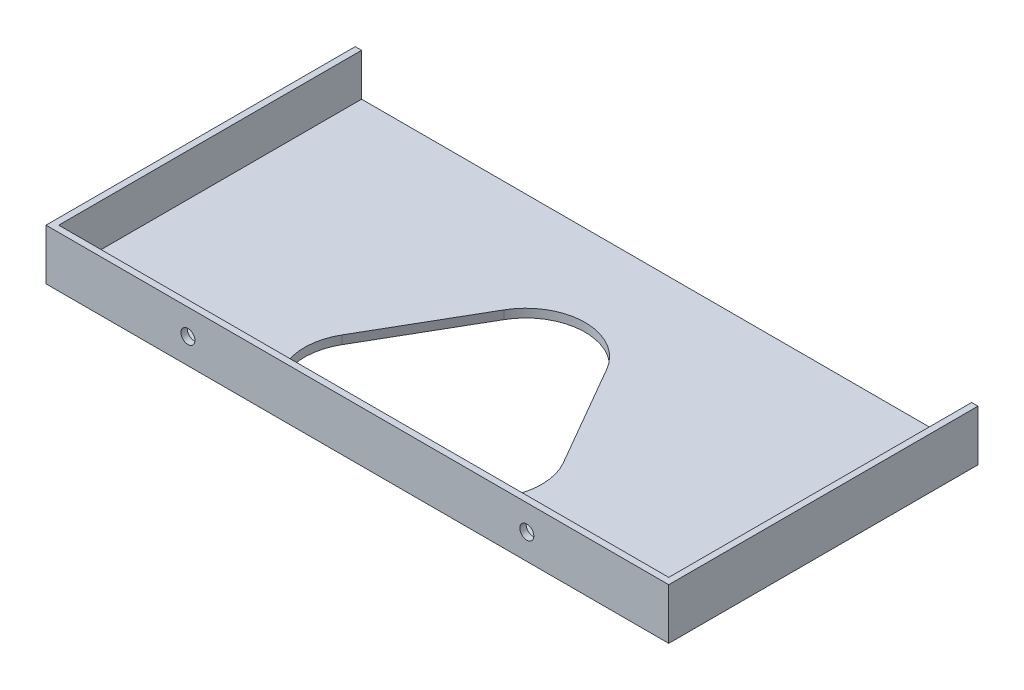
ISO-10303-21;
HEADER;
FILE_DESCRIPTION(('STEP AP214'),'2;1');
FILE_NAME('part.step','',(''),(''),'','','');
FILE_SCHEMA(('AUTOMOTIVE_DESIGN { 1 0 10303 214 1 1 1 1 }'));
ENDSEC;
DATA;
#1=APPLICATION_CONTEXT('core data for automotive mechanical design processes');
#2=APPLICATION_PROTOCOL_DEFINITION('international standard','automotive_design',2000,#1);
#3=PRODUCT_CONTEXT('',#1,'mechanical');
#4=PRODUCT('Part','Part','',(#3));
#5=PRODUCT_RELATED_PRODUCT_CATEGORY('part','',(#4));
#6=PRODUCT_DEFINITION_FORMATION('','',#4);
#7=PRODUCT_DEFINITION_CONTEXT('part definition',#1,'design');
#8=PRODUCT_DEFINITION('design','',#6,#7);
#9=PRODUCT_DEFINITION_SHAPE('','',#8);
#10=(LENGTH_UNIT() NAMED_UNIT(*) SI_UNIT(.MILLI.,.METRE.));
#11=(NAMED_UNIT(*) PLANE_ANGLE_UNIT() SI_UNIT($,.RADIAN.));
#12=(NAMED_UNIT(*) SI_UNIT($,.STERADIAN.) SOLID_ANGLE_UNIT());
#13=UNCERTAINTY_MEASURE_WITH_UNIT(LENGTH_MEASURE(1.E-05),#10,'distance_accuracy_value','');
#14=(GEOMETRIC_REPRESENTATION_CONTEXT(3) GLOBAL_UNCERTAINTY_ASSIGNED_CONTEXT((#13)) GLOBAL_UNIT_ASSIGNED_CONTEXT((#10,
#11,#12)) REPRESENTATION_CONTEXT('',''));
#15=CARTESIAN_POINT('',(0.,0.,0.));
#16=DIRECTION('',(0.,0.,1.));
#17=DIRECTION('',(1.,0.,0.));
#18=AXIS2_PLACEMENT_3D('',#15,#16,#17);
#19=CARTESIAN_POINT('',(0.,12.,0.));
#20=DIRECTION('',(1.,0.,0.));
#21=DIRECTION('',(0.,0.,-1.));
#22=AXIS2_PLACEMENT_3D('',#19,#20,#21);
#23=PLANE('',#22);
#24=DIRECTION('',(0.,0.,1.));
#25=VECTOR('',#24,1.);
#26=CARTESIAN_POINT('',(0.,12.,0.));
#27=LINE('',#26,#25);
#28=CARTESIAN_POINT('',(0.,12.,-73.));
#29=VERTEX_POINT('',#28);
#30=CARTESIAN_POINT('',(0.,12.,0.));
#31=VERTEX_POINT('',#30);
#32=EDGE_CURVE('E153',#29,#31,#27,.T.);
#33=ORIENTED_EDGE('',*,*,#32,.F.);
#34=DIRECTION('',(0.,1.,0.));
#35=VECTOR('',#34,1.);
#36=CARTESIAN_POINT('',(0.,0.,-73.));
#37=LINE('',#36,#35);
#38=CARTESIAN_POINT('',(0.,0.,-73.));
#39=VERTEX_POINT('',#38);
#40=EDGE_CURVE('E138',#39,#29,#37,.T.);
#41=ORIENTED_EDGE('',*,*,#40,.F.);
#42=DIRECTION('',(0.,0.,1.));
#43=VECTOR('',#42,1.);
#44=CARTESIAN_POINT('',(0.,0.,0.));
#45=LINE('',#44,#43);
#46=CARTESIAN_POINT('',(0.,0.,0.));
#47=VERTEX_POINT('',#46);
#48=EDGE_CURVE('E151',#39,#47,#45,.T.);
#49=ORIENTED_EDGE('',*,*,#48,.T.);
#50=DIRECTION('',(0.,-1.,0.));
#51=VECTOR('',#50,1.);
#52=CARTESIAN_POINT('',(0.,12.,0.));
#53=LINE('',#52,#51);
#54=EDGE_CURVE('E174',#31,#47,#53,.T.);
#55=ORIENTED_EDGE('',*,*,#54,.F.);
#56=EDGE_LOOP('',(#33,#41,#49,#55));
#57=FACE_BOUND('',#56,.T.);
#58=ADVANCED_FACE('F37',(#57),#23,.F.);
#59=CARTESIAN_POINT('',(0.,12.,0.));
#60=DIRECTION('',(0.,0.,-1.));
#61=DIRECTION('',(-1.,0.,0.));
#62=AXIS2_PLACEMENT_3D('',#59,#60,#61);
#63=PLANE('',#62);
#64=CARTESIAN_POINT('',(113.5,6.,0.));
#65=DIRECTION('',(0.,0.,-1.));
#66=DIRECTION('',(-1.,0.,0.));
#67=AXIS2_PLACEMENT_3D('',#64,#65,#66);
#68=CIRCLE('',#67,1.65);
#69=CARTESIAN_POINT('',(111.85,6.,0.));
#70=VERTEX_POINT('',#69);
#71=EDGE_CURVE('E217',#70,#70,#68,.T.);
#72=ORIENTED_EDGE('',*,*,#71,.T.);
#73=EDGE_LOOP('',(#72));
#74=FACE_BOUND('',#73,.T.);
#75=CARTESIAN_POINT('',(33.5,6.,0.));
#76=DIRECTION('',(0.,0.,-1.));
#77=DIRECTION('',(1.,0.,0.));
#78=AXIS2_PLACEMENT_3D('',#75,#76,#77);
#79=CIRCLE('',#78,1.65);
#80=CARTESIAN_POINT('',(35.15,6.,0.));
#81=VERTEX_POINT('',#80);
#82=EDGE_CURVE('E216',#81,#81,#79,.T.);
#83=ORIENTED_EDGE('',*,*,#82,.T.);
#84=EDGE_LOOP('',(#83));
#85=FACE_BOUND('',#84,.T.);
#86=DIRECTION('',(1.,0.,0.));
#87=VECTOR('',#86,1.);
#88=CARTESIAN_POINT('',(0.,0.,0.));
#89=LINE('',#88,#87);
#90=CARTESIAN_POINT('',(147.,0.,0.));
#91=VERTEX_POINT('',#90);
#92=EDGE_CURVE('E157',#47,#91,#89,.T.);
#93=ORIENTED_EDGE('',*,*,#92,.T.);
#94=DIRECTION('',(0.,-1.,0.));
#95=VECTOR('',#94,1.);
#96=CARTESIAN_POINT('',(147.,12.,0.));
#97=LINE('',#96,#95);
#98=CARTESIAN_POINT('',(147.,12.,0.));
#99=VERTEX_POINT('',#98);
#100=EDGE_CURVE('E171',#99,#91,#97,.T.);
#101=ORIENTED_EDGE('',*,*,#100,.F.);
#102=DIRECTION('',(1.,0.,0.));
#103=VECTOR('',#102,1.);
#104=CARTESIAN_POINT('',(0.,12.,0.));
#105=LINE('',#104,#103);
#106=EDGE_CURVE('E246',#31,#99,#105,.T.);
#107=ORIENTED_EDGE('',*,*,#106,.F.);
#108=ORIENTED_EDGE('',*,*,#54,.T.);
#109=EDGE_LOOP('',(#93,#101,#107,#108));
#110=FACE_BOUND('',#109,.T.);
#111=ADVANCED_FACE('F312',(#74,#85,#110),#63,.F.);
#112=CARTESIAN_POINT('',(147.,12.,0.));
#113=DIRECTION('',(-1.,0.,0.));
#114=DIRECTION('',(0.,0.,1.));
#115=AXIS2_PLACEMENT_3D('',#112,#113,#114);
#116=PLANE('',#115);
#117=DIRECTION('',(0.,0.,-1.));
#118=VECTOR('',#117,1.);
#119=CARTESIAN_POINT('',(147.,0.,0.));
#120=LINE('',#119,#118);
#121=CARTESIAN_POINT('',(147.,0.,-73.));
#122=VERTEX_POINT('',#121);
#123=EDGE_CURVE('E161',#91,#122,#120,.T.);
#124=ORIENTED_EDGE('',*,*,#123,.T.);
#125=DIRECTION('',(0.,1.,0.));
#126=VECTOR('',#125,1.);
#127=CARTESIAN_POINT('',(147.,0.,-73.));
#128=LINE('',#127,#126);
#129=CARTESIAN_POINT('',(147.,12.,-73.));
#130=VERTEX_POINT('',#129);
#131=EDGE_CURVE('E141',#122,#130,#128,.T.);
#132=ORIENTED_EDGE('',*,*,#131,.T.);
#133=DIRECTION('',(0.,0.,-1.));
#134=VECTOR('',#133,1.);
#135=CARTESIAN_POINT('',(147.,12.,0.));
#136=LINE('',#135,#134);
#137=EDGE_CURVE('E167',#99,#130,#136,.T.);
#138=ORIENTED_EDGE('',*,*,#137,.F.);
#139=ORIENTED_EDGE('',*,*,#100,.T.);
#140=EDGE_LOOP('',(#124,#132,#138,#139));
#141=FACE_BOUND('',#140,.T.);
#142=ADVANCED_FACE('F257',(#141),#116,.F.);
#143=CARTESIAN_POINT('',(0.,12.,0.));
#144=DIRECTION('',(0.,-1.,0.));
#145=DIRECTION('',(0.,0.,-1.));
#146=AXIS2_PLACEMENT_3D('',#143,#144,#145);
#147=PLANE('',#146);
#148=ORIENTED_EDGE('',*,*,#137,.T.);
#149=DIRECTION('',(1.,0.,0.));
#150=VECTOR('',#149,1.);
#151=CARTESIAN_POINT('',(0.,12.,-73.));
#152=LINE('',#151,#150);
#153=CARTESIAN_POINT('',(145.5,12.,-73.));
#154=VERTEX_POINT('',#153);
#155=EDGE_CURVE('E255',#154,#130,#152,.T.);
#156=ORIENTED_EDGE('',*,*,#155,.F.);
#157=DIRECTION('',(0.,0.,-1.));
#158=VECTOR('',#157,1.);
#159=CARTESIAN_POINT('',(145.5,12.,-1.5));
#160=LINE('',#159,#158);
#161=CARTESIAN_POINT('',(145.5,12.,-1.5));
#162=VERTEX_POINT('',#161);
#163=EDGE_CURVE('E229',#162,#154,#160,.T.);
#164=ORIENTED_EDGE('',*,*,#163,.F.);
#165=DIRECTION('',(1.,0.,0.));
#166=VECTOR('',#165,1.);
#167=CARTESIAN_POINT('',(1.5,12.,-1.5));
#168=LINE('',#167,#166);
#169=CARTESIAN_POINT('',(1.5,12.,-1.5));
#170=VERTEX_POINT('',#169);
#171=EDGE_CURVE('E233',#170,#162,#168,.T.);
#172=ORIENTED_EDGE('',*,*,#171,.F.);
#173=DIRECTION('',(0.,0.,1.));
#174=VECTOR('',#173,1.);
#175=CARTESIAN_POINT('',(1.5,12.,-74.5));
#176=LINE('',#175,#174);
#177=CARTESIAN_POINT('',(1.5,12.,-73.));
#178=VERTEX_POINT('',#177);
#179=EDGE_CURVE('E228',#178,#170,#176,.T.);
#180=ORIENTED_EDGE('',*,*,#179,.F.);
#181=EDGE_CURVE('E146',#29,#178,#152,.T.);
#182=ORIENTED_EDGE('',*,*,#181,.F.);
#183=ORIENTED_EDGE('',*,*,#32,.T.);
#184=ORIENTED_EDGE('',*,*,#106,.T.);
#185=EDGE_LOOP('',(#148,#156,#164,#172,#180,#182,#183,#184));
#186=FACE_BOUND('',#185,.T.);
#187=ADVANCED_FACE('F253',(#186),#147,.F.);
#188=CARTESIAN_POINT('',(0.,0.,0.));
#189=DIRECTION('',(0.,-1.,0.));
#190=DIRECTION('',(0.,0.,-1.));
#191=AXIS2_PLACEMENT_3D('',#188,#189,#190);
#192=PLANE('',#191);
#193=DIRECTION('',(1.,0.,0.));
#194=VECTOR('',#193,1.);
#195=CARTESIAN_POINT('',(0.,0.,-73.));
#196=LINE('',#195,#194);
#197=EDGE_CURVE('E135',#39,#122,#196,.T.);
#198=ORIENTED_EDGE('',*,*,#197,.T.);
#199=ORIENTED_EDGE('',*,*,#123,.F.);
#200=ORIENTED_EDGE('',*,*,#92,.F.);
#201=ORIENTED_EDGE('',*,*,#48,.F.);
#202=EDGE_LOOP('',(#198,#199,#200,#201));
#203=FACE_BOUND('',#202,.T.);
#204=CARTESIAN_POINT('',(59.5,0.,-15.5));
#205=DIRECTION('',(0.,-1.,0.));
#206=DIRECTION('',(0.,0.,-1.));
#207=AXIS2_PLACEMENT_3D('',#204,#205,#206);
#208=CIRCLE('',#207,14.);
#209=CARTESIAN_POINT('',(59.5,0.,-1.5));
#210=VERTEX_POINT('',#209);
#211=CARTESIAN_POINT('',(47.3756443470179,0.,-22.5));
#212=VERTEX_POINT('',#211);
#213=EDGE_CURVE('E58',#210,#212,#208,.T.);
#214=ORIENTED_EDGE('',*,*,#213,.F.);
#215=DIRECTION('',(-1.,0.,0.));
#216=VECTOR('',#215,1.);
#217=CARTESIAN_POINT('',(59.5,0.,-1.5));
#218=LINE('',#217,#216);
#219=CARTESIAN_POINT('',(87.5,0.,-1.49999999999999));
#220=VERTEX_POINT('',#219);
#221=EDGE_CURVE('E210',#220,#210,#218,.T.);
#222=ORIENTED_EDGE('',*,*,#221,.F.);
#223=CARTESIAN_POINT('',(87.5,0.,-15.5));
#224=DIRECTION('',(0.,-1.,0.));
#225=DIRECTION('',(0.,0.,-1.));
#226=AXIS2_PLACEMENT_3D('',#223,#224,#225);
#227=CIRCLE('',#226,14.);
#228=CARTESIAN_POINT('',(99.6243556529821,0.,-22.5));
#229=VERTEX_POINT('',#228);
#230=EDGE_CURVE('E272',#229,#220,#227,.T.);
#231=ORIENTED_EDGE('',*,*,#230,.F.);
#232=DIRECTION('',(0.5,0.,0.866025403784438));
#233=VECTOR('',#232,1.);
#234=CARTESIAN_POINT('',(99.6243556529821,0.,-22.5));
#235=LINE('',#234,#233);
#236=CARTESIAN_POINT('',(85.6243556529821,0.,-46.7487113059643));
#237=VERTEX_POINT('',#236);
#238=EDGE_CURVE('E270',#237,#229,#235,.T.);
#239=ORIENTED_EDGE('',*,*,#238,.F.);
#240=CARTESIAN_POINT('',(73.5,0.,-39.7487113059643));
#241=DIRECTION('',(0.,-1.,0.));
#242=DIRECTION('',(0.,0.,-1.));
#243=AXIS2_PLACEMENT_3D('',#240,#241,#242);
#244=CIRCLE('',#243,14.);
#245=CARTESIAN_POINT('',(61.3756443470179,0.,-46.7487113059643));
#246=VERTEX_POINT('',#245);
#247=EDGE_CURVE('E199',#246,#237,#244,.T.);
#248=ORIENTED_EDGE('',*,*,#247,.F.);
#249=DIRECTION('',(0.500000000000001,0.,-0.866025403784438));
#250=VECTOR('',#249,1.);
#251=CARTESIAN_POINT('',(61.3756443470179,0.,-46.7487113059643));
#252=LINE('',#251,#250);
#253=EDGE_CURVE('E266',#212,#246,#252,.T.);
#254=ORIENTED_EDGE('',*,*,#253,.F.);
#255=EDGE_LOOP('',(#214,#222,#231,#239,#248,#254));
#256=FACE_BOUND('',#255,.T.);
#257=ADVANCED_FACE('F155',(#203,#256),#192,.T.);
#258=CARTESIAN_POINT('',(0.,2.,0.));
#259=DIRECTION('',(0.,-1.,0.));
#260=DIRECTION('',(0.,0.,-1.));
#261=AXIS2_PLACEMENT_3D('',#258,#259,#260);
#262=PLANE('',#261);
#263=DIRECTION('',(0.,0.,-1.));
#264=VECTOR('',#263,1.);
#265=CARTESIAN_POINT('',(145.5,2.,-1.5));
#266=LINE('',#265,#264);
#267=CARTESIAN_POINT('',(145.5,2.,-1.5));
#268=VERTEX_POINT('',#267);
#269=CARTESIAN_POINT('',(145.5,2.,-73.));
#270=VERTEX_POINT('',#269);
#271=EDGE_CURVE('E159',#268,#270,#266,.T.);
#272=ORIENTED_EDGE('',*,*,#271,.T.);
#273=DIRECTION('',(-1.,0.,0.));
#274=VECTOR('',#273,1.);
#275=CARTESIAN_POINT('',(0.,2.,-73.));
#276=LINE('',#275,#274);
#277=CARTESIAN_POINT('',(1.5,2.,-73.));
#278=VERTEX_POINT('',#277);
#279=EDGE_CURVE('E51',#270,#278,#276,.T.);
#280=ORIENTED_EDGE('',*,*,#279,.T.);
#281=DIRECTION('',(0.,0.,1.));
#282=VECTOR('',#281,1.);
#283=CARTESIAN_POINT('',(1.5,2.,-74.5));
#284=LINE('',#283,#282);
#285=CARTESIAN_POINT('',(1.5,2.,-1.5));
#286=VERTEX_POINT('',#285);
#287=EDGE_CURVE('E232',#278,#286,#284,.T.);
#288=ORIENTED_EDGE('',*,*,#287,.T.);
#289=DIRECTION('',(1.,0.,0.));
#290=VECTOR('',#289,1.);
#291=CARTESIAN_POINT('',(1.5,2.,-1.5));
#292=LINE('',#291,#290);
#293=CARTESIAN_POINT('',(59.5,2.,-1.5));
#294=VERTEX_POINT('',#293);
#295=EDGE_CURVE('E239',#286,#294,#292,.T.);
#296=ORIENTED_EDGE('',*,*,#295,.T.);
#297=CARTESIAN_POINT('',(59.5,2.,-15.5));
#298=DIRECTION('',(0.,-1.,0.));
#299=DIRECTION('',(0.,0.,-1.));
#300=AXIS2_PLACEMENT_3D('',#297,#298,#299);
#301=CIRCLE('',#300,14.);
#302=CARTESIAN_POINT('',(47.3756443470179,2.,-22.5));
#303=VERTEX_POINT('',#302);
#304=EDGE_CURVE('E212',#294,#303,#301,.T.);
#305=ORIENTED_EDGE('',*,*,#304,.T.);
#306=DIRECTION('',(0.500000000000001,0.,-0.866025403784438));
#307=VECTOR('',#306,1.);
#308=CARTESIAN_POINT('',(25.7889474676884,2.,14.889255762587));
#309=LINE('',#308,#307);
#310=CARTESIAN_POINT('',(61.3756443470179,2.,-46.7487113059643));
#311=VERTEX_POINT('',#310);
#312=EDGE_CURVE('E176',#303,#311,#309,.T.);
#313=ORIENTED_EDGE('',*,*,#312,.T.);
#314=CARTESIAN_POINT('',(73.5,2.,-39.7487113059643));
#315=DIRECTION('',(0.,-1.,0.));
#316=DIRECTION('',(0.,0.,-1.));
#317=AXIS2_PLACEMENT_3D('',#314,#315,#316);
#318=CIRCLE('',#317,14.);
#319=CARTESIAN_POINT('',(85.6243556529821,2.,-46.7487113059643));
#320=VERTEX_POINT('',#319);
#321=EDGE_CURVE('E179',#311,#320,#318,.T.);
#322=ORIENTED_EDGE('',*,*,#321,.T.);
#323=DIRECTION('',(0.5,0.,0.866025403784438));
#324=VECTOR('',#323,1.);
#325=CARTESIAN_POINT('',(84.4610525323115,2.,-48.7636114155692));
#326=LINE('',#325,#324);
#327=CARTESIAN_POINT('',(99.6243556529821,2.,-22.5));
#328=VERTEX_POINT('',#327);
#329=EDGE_CURVE('E44',#320,#328,#326,.T.);
#330=ORIENTED_EDGE('',*,*,#329,.T.);
#331=CARTESIAN_POINT('',(87.5,2.,-15.5));
#332=DIRECTION('',(0.,-1.,0.));
#333=DIRECTION('',(0.,0.,-1.));
#334=AXIS2_PLACEMENT_3D('',#331,#332,#333);
#335=CIRCLE('',#334,14.);
#336=CARTESIAN_POINT('',(87.5,2.,-1.49999999999999));
#337=VERTEX_POINT('',#336);
#338=EDGE_CURVE('E185',#328,#337,#335,.T.);
#339=ORIENTED_EDGE('',*,*,#338,.T.);
#340=EDGE_CURVE('E242',#337,#268,#292,.T.);
#341=ORIENTED_EDGE('',*,*,#340,.T.);
#342=EDGE_LOOP('',(#272,#280,#288,#296,#305,#313,#322,#330,#339,#341));
#343=FACE_BOUND('',#342,.T.);
#344=ADVANCED_FACE('F184',(#343),#262,.F.);
#345=CARTESIAN_POINT('',(1.5,-161.446585594122,-74.5));
#346=DIRECTION('',(-1.,0.,0.));
#347=DIRECTION('',(0.,0.,1.));
#348=AXIS2_PLACEMENT_3D('',#345,#346,#347);
#349=PLANE('',#348);
#350=ORIENTED_EDGE('',*,*,#287,.F.);
#351=DIRECTION('',(0.,1.,0.));
#352=VECTOR('',#351,1.);
#353=CARTESIAN_POINT('',(1.5,-161.446585594122,-73.));
#354=LINE('',#353,#352);
#355=EDGE_CURVE('E259',#278,#178,#354,.T.);
#356=ORIENTED_EDGE('',*,*,#355,.T.);
#357=ORIENTED_EDGE('',*,*,#179,.T.);
#358=DIRECTION('',(0.,1.,0.));
#359=VECTOR('',#358,1.);
#360=CARTESIAN_POINT('',(1.5,-161.446585594122,-1.5));
#361=LINE('',#360,#359);
#362=EDGE_CURVE('E237',#286,#170,#361,.T.);
#363=ORIENTED_EDGE('',*,*,#362,.F.);
#364=EDGE_LOOP('',(#350,#356,#357,#363));
#365=FACE_BOUND('',#364,.T.);
#366=ADVANCED_FACE('F295',(#365),#349,.F.);
#367=CARTESIAN_POINT('',(1.5,-161.446585594122,-1.5));
#368=DIRECTION('',(0.,0.,1.));
#369=DIRECTION('',(1.,0.,0.));
#370=AXIS2_PLACEMENT_3D('',#367,#368,#369);
#371=PLANE('',#370);
#372=ORIENTED_EDGE('',*,*,#340,.F.);
#373=DIRECTION('',(0.,-1.,0.));
#374=VECTOR('',#373,1.);
#375=CARTESIAN_POINT('',(87.5,10.,-1.49999999999999));
#376=LINE('',#375,#374);
#377=EDGE_CURVE('E203',#337,#220,#376,.T.);
#378=ORIENTED_EDGE('',*,*,#377,.T.);
#379=ORIENTED_EDGE('',*,*,#221,.T.);
#380=DIRECTION('',(0.,-1.,0.));
#381=VECTOR('',#380,1.);
#382=CARTESIAN_POINT('',(59.5,10.,-1.5));
#383=LINE('',#382,#381);
#384=EDGE_CURVE('E213',#294,#210,#383,.T.);
#385=ORIENTED_EDGE('',*,*,#384,.F.);
#386=ORIENTED_EDGE('',*,*,#295,.F.);
#387=ORIENTED_EDGE('',*,*,#362,.T.);
#388=ORIENTED_EDGE('',*,*,#171,.T.);
#389=DIRECTION('',(0.,1.,0.));
#390=VECTOR('',#389,1.);
#391=CARTESIAN_POINT('',(145.5,-161.446585594122,-1.5));
#392=LINE('',#391,#390);
#393=EDGE_CURVE('E164',#268,#162,#392,.T.);
#394=ORIENTED_EDGE('',*,*,#393,.F.);
#395=EDGE_LOOP('',(#372,#378,#379,#385,#386,#387,#388,#394));
#396=FACE_BOUND('',#395,.T.);
#397=CARTESIAN_POINT('',(113.5,6.,-1.5));
#398=DIRECTION('',(0.,0.,1.));
#399=DIRECTION('',(1.,0.,0.));
#400=AXIS2_PLACEMENT_3D('',#397,#398,#399);
#401=CIRCLE('',#400,1.65);
#402=CARTESIAN_POINT('',(115.15,6.,-1.5));
#403=VERTEX_POINT('',#402);
#404=EDGE_CURVE('E225',#403,#403,#401,.T.);
#405=ORIENTED_EDGE('',*,*,#404,.T.);
#406=EDGE_LOOP('',(#405));
#407=FACE_BOUND('',#406,.T.);
#408=CARTESIAN_POINT('',(33.5,6.,-1.5));
#409=DIRECTION('',(0.,0.,1.));
#410=DIRECTION('',(1.,0.,0.));
#411=AXIS2_PLACEMENT_3D('',#408,#409,#410);
#412=CIRCLE('',#411,1.65);
#413=CARTESIAN_POINT('',(35.15,6.,-1.5));
#414=VERTEX_POINT('',#413);
#415=EDGE_CURVE('E220',#414,#414,#412,.T.);
#416=ORIENTED_EDGE('',*,*,#415,.T.);
#417=EDGE_LOOP('',(#416));
#418=FACE_BOUND('',#417,.T.);
#419=ADVANCED_FACE('F278',(#396,#407,#418),#371,.F.);
#420=CARTESIAN_POINT('',(145.5,-161.446585594122,-1.5));
#421=DIRECTION('',(1.,0.,0.));
#422=DIRECTION('',(0.,0.,-1.));
#423=AXIS2_PLACEMENT_3D('',#420,#421,#422);
#424=PLANE('',#423);
#425=ORIENTED_EDGE('',*,*,#163,.T.);
#426=DIRECTION('',(0.,-1.,0.));
#427=VECTOR('',#426,1.);
#428=CARTESIAN_POINT('',(145.5,-161.446585594122,-73.));
#429=LINE('',#428,#427);
#430=EDGE_CURVE('E12',#154,#270,#429,.T.);
#431=ORIENTED_EDGE('',*,*,#430,.T.);
#432=ORIENTED_EDGE('',*,*,#271,.F.);
#433=ORIENTED_EDGE('',*,*,#393,.T.);
#434=EDGE_LOOP('',(#425,#431,#432,#433));
#435=FACE_BOUND('',#434,.T.);
#436=ADVANCED_FACE('F299',(#435),#424,.F.);
#437=CARTESIAN_POINT('',(33.5,6.,0.));
#438=DIRECTION('',(0.,0.,-1.));
#439=DIRECTION('',(-1.,0.,0.));
#440=AXIS2_PLACEMENT_3D('',#437,#438,#439);
#441=CYLINDRICAL_SURFACE('',#440,1.65);
#442=ORIENTED_EDGE('',*,*,#82,.F.);
#443=EDGE_LOOP('',(#442));
#444=FACE_BOUND('',#443,.T.);
#445=ORIENTED_EDGE('',*,*,#415,.F.);
#446=EDGE_LOOP('',(#445));
#447=FACE_BOUND('',#446,.T.);
#448=ADVANCED_FACE('F301',(#444,#447),#441,.F.);
#449=CARTESIAN_POINT('',(113.5,6.,0.));
#450=DIRECTION('',(0.,0.,-1.));
#451=DIRECTION('',(-1.,0.,0.));
#452=AXIS2_PLACEMENT_3D('',#449,#450,#451);
#453=CYLINDRICAL_SURFACE('',#452,1.65);
#454=ORIENTED_EDGE('',*,*,#71,.F.);
#455=EDGE_LOOP('',(#454));
#456=FACE_BOUND('',#455,.T.);
#457=ORIENTED_EDGE('',*,*,#404,.F.);
#458=EDGE_LOOP('',(#457));
#459=FACE_BOUND('',#458,.T.);
#460=ADVANCED_FACE('F307',(#456,#459),#453,.F.);
#461=CARTESIAN_POINT('',(99.6243556529821,10.,-22.5));
#462=DIRECTION('',(0.866025403784438,0.,-0.5));
#463=DIRECTION('',(-0.5,0.,-0.866025403784438));
#464=AXIS2_PLACEMENT_3D('',#461,#462,#463);
#465=PLANE('',#464);
#466=DIRECTION('',(0.,-1.,0.));
#467=VECTOR('',#466,1.);
#468=CARTESIAN_POINT('',(85.6243556529821,10.,-46.7487113059643));
#469=LINE('',#468,#467);
#470=EDGE_CURVE('E193',#320,#237,#469,.T.);
#471=ORIENTED_EDGE('',*,*,#470,.T.);
#472=ORIENTED_EDGE('',*,*,#238,.T.);
#473=DIRECTION('',(0.,-1.,0.));
#474=VECTOR('',#473,1.);
#475=CARTESIAN_POINT('',(99.6243556529821,10.,-22.5));
#476=LINE('',#475,#474);
#477=EDGE_CURVE('E195',#328,#229,#476,.T.);
#478=ORIENTED_EDGE('',*,*,#477,.F.);
#479=ORIENTED_EDGE('',*,*,#329,.F.);
#480=EDGE_LOOP('',(#471,#472,#478,#479));
#481=FACE_BOUND('',#480,.T.);
#482=ADVANCED_FACE('F191',(#481),#465,.F.);
#483=CARTESIAN_POINT('',(73.5,10.,-39.7487113059643));
#484=DIRECTION('',(0.,-1.,0.));
#485=DIRECTION('',(0.,0.,-1.));
#486=AXIS2_PLACEMENT_3D('',#483,#484,#485);
#487=CYLINDRICAL_SURFACE('',#486,14.);
#488=DIRECTION('',(0.,-1.,0.));
#489=VECTOR('',#488,1.);
#490=CARTESIAN_POINT('',(61.3756443470179,10.,-46.7487113059643));
#491=LINE('',#490,#489);
#492=EDGE_CURVE('E201',#311,#246,#491,.T.);
#493=ORIENTED_EDGE('',*,*,#492,.T.);
#494=ORIENTED_EDGE('',*,*,#247,.T.);
#495=ORIENTED_EDGE('',*,*,#470,.F.);
#496=ORIENTED_EDGE('',*,*,#321,.F.);
#497=EDGE_LOOP('',(#493,#494,#495,#496));
#498=FACE_BOUND('',#497,.T.);
#499=ADVANCED_FACE('F197',(#498),#487,.F.);
#500=CARTESIAN_POINT('',(61.3756443470179,10.,-46.7487113059643));
#501=DIRECTION('',(-0.866025403784438,0.,-0.500000000000001));
#502=DIRECTION('',(-0.500000000000001,0.,0.866025403784438));
#503=AXIS2_PLACEMENT_3D('',#500,#501,#502);
#504=PLANE('',#503);
#505=DIRECTION('',(0.,-1.,0.));
#506=VECTOR('',#505,1.);
#507=CARTESIAN_POINT('',(47.3756443470179,10.,-22.5));
#508=LINE('',#507,#506);
#509=EDGE_CURVE('E205',#303,#212,#508,.T.);
#510=ORIENTED_EDGE('',*,*,#509,.T.);
#511=ORIENTED_EDGE('',*,*,#253,.T.);
#512=ORIENTED_EDGE('',*,*,#492,.F.);
#513=ORIENTED_EDGE('',*,*,#312,.F.);
#514=EDGE_LOOP('',(#510,#511,#512,#513));
#515=FACE_BOUND('',#514,.T.);
#516=ADVANCED_FACE('F288',(#515),#504,.F.);
#517=CARTESIAN_POINT('',(59.5,10.,-15.5));
#518=DIRECTION('',(0.,-1.,0.));
#519=DIRECTION('',(0.,0.,-1.));
#520=AXIS2_PLACEMENT_3D('',#517,#518,#519);
#521=CYLINDRICAL_SURFACE('',#520,14.);
#522=ORIENTED_EDGE('',*,*,#384,.T.);
#523=ORIENTED_EDGE('',*,*,#213,.T.);
#524=ORIENTED_EDGE('',*,*,#509,.F.);
#525=ORIENTED_EDGE('',*,*,#304,.F.);
#526=EDGE_LOOP('',(#522,#523,#524,#525));
#527=FACE_BOUND('',#526,.T.);
#528=ADVANCED_FACE('F289',(#527),#521,.F.);
#529=CARTESIAN_POINT('',(87.5,10.,-15.5));
#530=DIRECTION('',(0.,-1.,0.));
#531=DIRECTION('',(0.,0.,-1.));
#532=AXIS2_PLACEMENT_3D('',#529,#530,#531);
#533=CYLINDRICAL_SURFACE('',#532,14.);
#534=ORIENTED_EDGE('',*,*,#477,.T.);
#535=ORIENTED_EDGE('',*,*,#230,.T.);
#536=ORIENTED_EDGE('',*,*,#377,.F.);
#537=ORIENTED_EDGE('',*,*,#338,.F.);
#538=EDGE_LOOP('',(#534,#535,#536,#537));
#539=FACE_BOUND('',#538,.T.);
#540=ADVANCED_FACE('F285',(#539),#533,.F.);
#541=CARTESIAN_POINT('',(0.,0.,-73.));
#542=DIRECTION('',(0.,0.,1.));
#543=DIRECTION('',(1.,0.,0.));
#544=AXIS2_PLACEMENT_3D('',#541,#542,#543);
#545=PLANE('',#544);
#546=ORIENTED_EDGE('',*,*,#279,.F.);
#547=ORIENTED_EDGE('',*,*,#430,.F.);
#548=ORIENTED_EDGE('',*,*,#155,.T.);
#549=ORIENTED_EDGE('',*,*,#131,.F.);
#550=ORIENTED_EDGE('',*,*,#197,.F.);
#551=ORIENTED_EDGE('',*,*,#40,.T.);
#552=ORIENTED_EDGE('',*,*,#181,.T.);
#553=ORIENTED_EDGE('',*,*,#355,.F.);
#554=EDGE_LOOP('',(#546,#547,#548,#549,#550,#551,#552,#553));
#555=FACE_BOUND('',#554,.T.);
#556=ADVANCED_FACE('F137',(#555),#545,.F.);
#557=CLOSED_SHELL('',(#58,#111,#142,#187,#257,#344,#366,#419,#436,#448,#460,#482,#499,#516,#528,
#540,#556));
#558=MANIFOLD_SOLID_BREP('B2',#557);
#559=ADVANCED_BREP_SHAPE_REPRESENTATION('',(#18,#558),#14);
#560=SHAPE_DEFINITION_REPRESENTATION(#9,#559);
ENDSEC;
END-ISO-10303-21;
